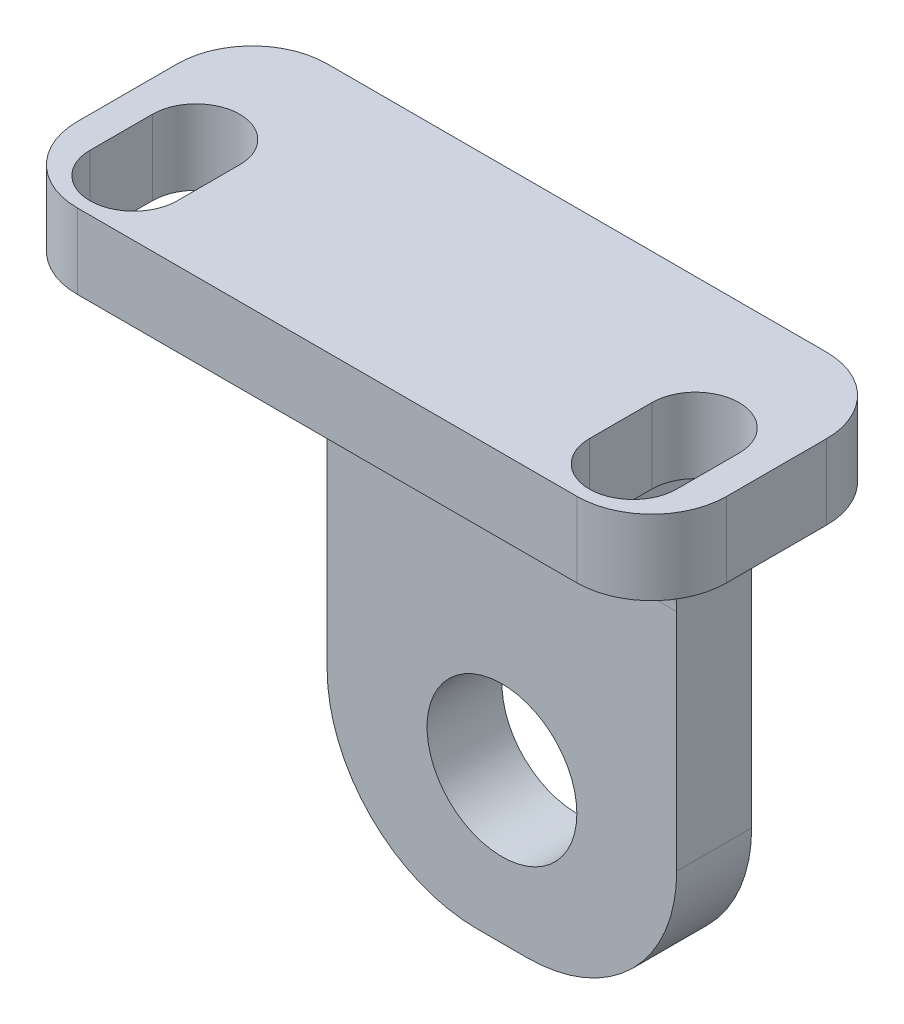
ISO-10303-21;
HEADER;
FILE_DESCRIPTION(('STEP AP214'),'2;1');
FILE_NAME('part.step','',(''),(''),'','','');
FILE_SCHEMA(('AUTOMOTIVE_DESIGN { 1 0 10303 214 1 1 1 1 }'));
ENDSEC;
DATA;
#1=APPLICATION_CONTEXT('core data for automotive mechanical design processes');
#2=APPLICATION_PROTOCOL_DEFINITION('international standard','automotive_design',2000,#1);
#3=PRODUCT_CONTEXT('',#1,'mechanical');
#4=PRODUCT('Part','Part','',(#3));
#5=PRODUCT_RELATED_PRODUCT_CATEGORY('part','',(#4));
#6=PRODUCT_DEFINITION_FORMATION('','',#4);
#7=PRODUCT_DEFINITION_CONTEXT('part definition',#1,'design');
#8=PRODUCT_DEFINITION('design','',#6,#7);
#9=PRODUCT_DEFINITION_SHAPE('','',#8);
#10=(LENGTH_UNIT() NAMED_UNIT(*) SI_UNIT(.MILLI.,.METRE.));
#11=(NAMED_UNIT(*) PLANE_ANGLE_UNIT() SI_UNIT($,.RADIAN.));
#12=(NAMED_UNIT(*) SI_UNIT($,.STERADIAN.) SOLID_ANGLE_UNIT());
#13=UNCERTAINTY_MEASURE_WITH_UNIT(LENGTH_MEASURE(1.E-05),#10,'distance_accuracy_value','');
#14=(GEOMETRIC_REPRESENTATION_CONTEXT(3) GLOBAL_UNCERTAINTY_ASSIGNED_CONTEXT((#13)) GLOBAL_UNIT_ASSIGNED_CONTEXT((#10,
#11,#12)) REPRESENTATION_CONTEXT('',''));
#15=CARTESIAN_POINT('',(0.,0.,0.));
#16=DIRECTION('',(0.,0.,1.));
#17=DIRECTION('',(1.,0.,0.));
#18=AXIS2_PLACEMENT_3D('',#15,#16,#17);
#19=CARTESIAN_POINT('',(0.,24.,0.));
#20=DIRECTION('',(0.,1.,0.));
#21=DIRECTION('',(0.,0.,1.));
#22=AXIS2_PLACEMENT_3D('',#19,#20,#21);
#23=PLANE('',#22);
#24=CARTESIAN_POINT('',(-10.,24.,7.75000000000001));
#25=DIRECTION('',(0.,1.,0.));
#26=DIRECTION('',(0.,0.,1.));
#27=AXIS2_PLACEMENT_3D('',#24,#25,#26);
#28=CIRCLE('',#27,1.75);
#29=CARTESIAN_POINT('',(-11.75,24.,7.75000000000001));
#30=VERTEX_POINT('',#29);
#31=CARTESIAN_POINT('',(-8.25,24.,7.75));
#32=VERTEX_POINT('',#31);
#33=EDGE_CURVE('E254',#30,#32,#28,.T.);
#34=ORIENTED_EDGE('',*,*,#33,.F.);
#35=DIRECTION('',(0.,0.,-1.));
#36=VECTOR('',#35,1.);
#37=CARTESIAN_POINT('',(-11.75,24.,7.75000000000001));
#38=LINE('',#37,#36);
#39=CARTESIAN_POINT('',(-11.75,24.,5.25000000000001));
#40=VERTEX_POINT('',#39);
#41=EDGE_CURVE('E240',#30,#40,#38,.T.);
#42=ORIENTED_EDGE('',*,*,#41,.T.);
#43=CARTESIAN_POINT('',(-10.,24.,5.25000000000001));
#44=DIRECTION('',(0.,1.,0.));
#45=DIRECTION('',(0.,0.,1.));
#46=AXIS2_PLACEMENT_3D('',#43,#44,#45);
#47=CIRCLE('',#46,1.75);
#48=CARTESIAN_POINT('',(-8.25,24.,5.25000000000002));
#49=VERTEX_POINT('',#48);
#50=EDGE_CURVE('E248',#49,#40,#47,.T.);
#51=ORIENTED_EDGE('',*,*,#50,.F.);
#52=DIRECTION('',(0.,0.,-1.));
#53=VECTOR('',#52,1.);
#54=CARTESIAN_POINT('',(-8.25,24.,7.75));
#55=LINE('',#54,#53);
#56=EDGE_CURVE('E251',#32,#49,#55,.T.);
#57=ORIENTED_EDGE('',*,*,#56,.F.);
#58=EDGE_LOOP('',(#34,#42,#51,#57));
#59=FACE_BOUND('',#58,.T.);
#60=DIRECTION('',(0.,0.,-1.));
#61=VECTOR('',#60,1.);
#62=CARTESIAN_POINT('',(13.,24.,10.));
#63=LINE('',#62,#61);
#64=CARTESIAN_POINT('',(13.,24.,7.));
#65=VERTEX_POINT('',#64);
#66=CARTESIAN_POINT('',(13.,24.,3.));
#67=VERTEX_POINT('',#66);
#68=EDGE_CURVE('E281',#65,#67,#63,.T.);
#69=ORIENTED_EDGE('',*,*,#68,.T.);
#70=CARTESIAN_POINT('',(10.,24.,3.));
#71=DIRECTION('',(0.,1.,0.));
#72=DIRECTION('',(0.,0.,1.));
#73=AXIS2_PLACEMENT_3D('',#70,#71,#72);
#74=CIRCLE('',#73,3.);
#75=CARTESIAN_POINT('',(10.,24.,0.));
#76=VERTEX_POINT('',#75);
#77=EDGE_CURVE('E326',#67,#76,#74,.T.);
#78=ORIENTED_EDGE('',*,*,#77,.T.);
#79=DIRECTION('',(-1.,0.,0.));
#80=VECTOR('',#79,1.);
#81=CARTESIAN_POINT('',(-7.,24.,0.));
#82=LINE('',#81,#80);
#83=CARTESIAN_POINT('',(-10.,24.,0.));
#84=VERTEX_POINT('',#83);
#85=EDGE_CURVE('E296',#76,#84,#82,.T.);
#86=ORIENTED_EDGE('',*,*,#85,.T.);
#87=CARTESIAN_POINT('',(-10.,24.,3.));
#88=DIRECTION('',(0.,1.,0.));
#89=DIRECTION('',(0.,0.,1.));
#90=AXIS2_PLACEMENT_3D('',#87,#88,#89);
#91=CIRCLE('',#90,3.);
#92=CARTESIAN_POINT('',(-13.,24.,3.));
#93=VERTEX_POINT('',#92);
#94=EDGE_CURVE('E324',#84,#93,#91,.T.);
#95=ORIENTED_EDGE('',*,*,#94,.T.);
#96=DIRECTION('',(0.,0.,-1.));
#97=VECTOR('',#96,1.);
#98=CARTESIAN_POINT('',(-13.,24.,10.));
#99=LINE('',#98,#97);
#100=CARTESIAN_POINT('',(-13.,24.,7.));
#101=VERTEX_POINT('',#100);
#102=EDGE_CURVE('E278',#101,#93,#99,.T.);
#103=ORIENTED_EDGE('',*,*,#102,.F.);
#104=CARTESIAN_POINT('',(-10.,24.,7.));
#105=DIRECTION('',(0.,1.,0.));
#106=DIRECTION('',(0.,0.,1.));
#107=AXIS2_PLACEMENT_3D('',#104,#105,#106);
#108=CIRCLE('',#107,3.);
#109=CARTESIAN_POINT('',(-10.,24.,10.));
#110=VERTEX_POINT('',#109);
#111=EDGE_CURVE('E320',#101,#110,#108,.T.);
#112=ORIENTED_EDGE('',*,*,#111,.T.);
#113=DIRECTION('',(-1.,0.,0.));
#114=VECTOR('',#113,1.);
#115=CARTESIAN_POINT('',(13.,24.,10.));
#116=LINE('',#115,#114);
#117=CARTESIAN_POINT('',(10.,24.,10.));
#118=VERTEX_POINT('',#117);
#119=EDGE_CURVE('E264',#118,#110,#116,.T.);
#120=ORIENTED_EDGE('',*,*,#119,.F.);
#121=CARTESIAN_POINT('',(10.,24.,7.));
#122=DIRECTION('',(0.,1.,0.));
#123=DIRECTION('',(0.,0.,1.));
#124=AXIS2_PLACEMENT_3D('',#121,#122,#123);
#125=CIRCLE('',#124,3.);
#126=EDGE_CURVE('E322',#118,#65,#125,.T.);
#127=ORIENTED_EDGE('',*,*,#126,.T.);
#128=EDGE_LOOP('',(#69,#78,#86,#95,#103,#112,#120,#127));
#129=FACE_BOUND('',#128,.T.);
#130=DIRECTION('',(0.,0.,-1.));
#131=VECTOR('',#130,1.);
#132=CARTESIAN_POINT('',(8.25,24.,0.));
#133=LINE('',#132,#131);
#134=CARTESIAN_POINT('',(8.25,24.,7.75));
#135=VERTEX_POINT('',#134);
#136=CARTESIAN_POINT('',(8.25,24.,5.25000000000002));
#137=VERTEX_POINT('',#136);
#138=EDGE_CURVE('E217',#135,#137,#133,.T.);
#139=ORIENTED_EDGE('',*,*,#138,.T.);
#140=CARTESIAN_POINT('',(10.,24.,5.25000000000001));
#141=DIRECTION('',(0.,1.,0.));
#142=DIRECTION('',(0.,0.,1.));
#143=AXIS2_PLACEMENT_3D('',#140,#141,#142);
#144=CIRCLE('',#143,1.75);
#145=CARTESIAN_POINT('',(11.75,24.,5.25000000000001));
#146=VERTEX_POINT('',#145);
#147=EDGE_CURVE('E210',#137,#146,#144,.F.);
#148=ORIENTED_EDGE('',*,*,#147,.T.);
#149=DIRECTION('',(0.,0.,-1.));
#150=VECTOR('',#149,1.);
#151=CARTESIAN_POINT('',(11.75,24.,0.));
#152=LINE('',#151,#150);
#153=CARTESIAN_POINT('',(11.75,24.,7.75));
#154=VERTEX_POINT('',#153);
#155=EDGE_CURVE('E211',#154,#146,#152,.T.);
#156=ORIENTED_EDGE('',*,*,#155,.F.);
#157=CARTESIAN_POINT('',(10.,24.,7.75000000000001));
#158=DIRECTION('',(0.,1.,0.));
#159=DIRECTION('',(0.,0.,1.));
#160=AXIS2_PLACEMENT_3D('',#157,#158,#159);
#161=CIRCLE('',#160,1.75);
#162=EDGE_CURVE('E224',#154,#135,#161,.F.);
#163=ORIENTED_EDGE('',*,*,#162,.T.);
#164=EDGE_LOOP('',(#139,#148,#156,#163));
#165=FACE_BOUND('',#164,.T.);
#166=ADVANCED_FACE('F33',(#59,#129,#165),#23,.T.);
#167=CARTESIAN_POINT('',(13.,21.,10.));
#168=DIRECTION('',(0.,1.,0.));
#169=DIRECTION('',(-1.,0.,0.));
#170=AXIS2_PLACEMENT_3D('',#167,#168,#169);
#171=PLANE('',#170);
#172=DIRECTION('',(1.,0.,0.));
#173=VECTOR('',#172,1.);
#174=CARTESIAN_POINT('',(7.,21.,9.));
#175=LINE('',#174,#173);
#176=CARTESIAN_POINT('',(-7.,21.,9.));
#177=VERTEX_POINT('',#176);
#178=CARTESIAN_POINT('',(7.00000000000001,21.,9.));
#179=VERTEX_POINT('',#178);
#180=EDGE_CURVE('E351',#177,#179,#175,.T.);
#181=ORIENTED_EDGE('',*,*,#180,.T.);
#182=DIRECTION('',(0.,0.,-1.));
#183=VECTOR('',#182,1.);
#184=CARTESIAN_POINT('',(7.,21.,0.));
#185=LINE('',#184,#183);
#186=CARTESIAN_POINT('',(7.,21.,0.));
#187=VERTEX_POINT('',#186);
#188=EDGE_CURVE('E286',#179,#187,#185,.T.);
#189=ORIENTED_EDGE('',*,*,#188,.T.);
#190=DIRECTION('',(1.,0.,0.));
#191=VECTOR('',#190,1.);
#192=CARTESIAN_POINT('',(13.,21.,0.));
#193=LINE('',#192,#191);
#194=CARTESIAN_POINT('',(10.,21.,0.));
#195=VERTEX_POINT('',#194);
#196=EDGE_CURVE('E202',#187,#195,#193,.T.);
#197=ORIENTED_EDGE('',*,*,#196,.T.);
#198=CARTESIAN_POINT('',(10.,21.,3.));
#199=DIRECTION('',(0.,1.,0.));
#200=DIRECTION('',(-1.,0.,0.));
#201=AXIS2_PLACEMENT_3D('',#198,#199,#200);
#202=CIRCLE('',#201,3.);
#203=CARTESIAN_POINT('',(13.,21.,3.));
#204=VERTEX_POINT('',#203);
#205=EDGE_CURVE('E338',#195,#204,#202,.F.);
#206=ORIENTED_EDGE('',*,*,#205,.T.);
#207=DIRECTION('',(0.,0.,-1.));
#208=VECTOR('',#207,1.);
#209=CARTESIAN_POINT('',(13.,21.,10.));
#210=LINE('',#209,#208);
#211=CARTESIAN_POINT('',(13.,21.,7.));
#212=VERTEX_POINT('',#211);
#213=EDGE_CURVE('E271',#212,#204,#210,.T.);
#214=ORIENTED_EDGE('',*,*,#213,.F.);
#215=CARTESIAN_POINT('',(10.,21.,7.));
#216=DIRECTION('',(0.,1.,0.));
#217=DIRECTION('',(-1.,0.,0.));
#218=AXIS2_PLACEMENT_3D('',#215,#216,#217);
#219=CIRCLE('',#218,3.);
#220=CARTESIAN_POINT('',(10.,21.,10.));
#221=VERTEX_POINT('',#220);
#222=EDGE_CURVE('E334',#212,#221,#219,.F.);
#223=ORIENTED_EDGE('',*,*,#222,.T.);
#224=DIRECTION('',(1.,0.,0.));
#225=VECTOR('',#224,1.);
#226=CARTESIAN_POINT('',(13.,21.,10.));
#227=LINE('',#226,#225);
#228=CARTESIAN_POINT('',(-10.,21.,10.));
#229=VERTEX_POINT('',#228);
#230=EDGE_CURVE('E267',#229,#221,#227,.T.);
#231=ORIENTED_EDGE('',*,*,#230,.F.);
#232=CARTESIAN_POINT('',(-10.,21.,7.));
#233=DIRECTION('',(0.,1.,0.));
#234=DIRECTION('',(-1.,0.,0.));
#235=AXIS2_PLACEMENT_3D('',#232,#233,#234);
#236=CIRCLE('',#235,3.);
#237=CARTESIAN_POINT('',(-13.,21.,7.));
#238=VERTEX_POINT('',#237);
#239=EDGE_CURVE('E332',#229,#238,#236,.F.);
#240=ORIENTED_EDGE('',*,*,#239,.T.);
#241=DIRECTION('',(0.,0.,-1.));
#242=VECTOR('',#241,1.);
#243=CARTESIAN_POINT('',(-13.,21.,10.));
#244=LINE('',#243,#242);
#245=CARTESIAN_POINT('',(-13.,21.,3.));
#246=VERTEX_POINT('',#245);
#247=EDGE_CURVE('E275',#238,#246,#244,.T.);
#248=ORIENTED_EDGE('',*,*,#247,.T.);
#249=CARTESIAN_POINT('',(-10.,21.,3.));
#250=DIRECTION('',(0.,1.,0.));
#251=DIRECTION('',(-1.,0.,0.));
#252=AXIS2_PLACEMENT_3D('',#249,#250,#251);
#253=CIRCLE('',#252,3.);
#254=CARTESIAN_POINT('',(-10.,21.,0.));
#255=VERTEX_POINT('',#254);
#256=EDGE_CURVE('E336',#246,#255,#253,.F.);
#257=ORIENTED_EDGE('',*,*,#256,.T.);
#258=CARTESIAN_POINT('',(-7.,21.,0.));
#259=VERTEX_POINT('',#258);
#260=EDGE_CURVE('E268',#255,#259,#193,.T.);
#261=ORIENTED_EDGE('',*,*,#260,.T.);
#262=DIRECTION('',(0.,0.,1.));
#263=VECTOR('',#262,1.);
#264=CARTESIAN_POINT('',(-7.,21.,0.));
#265=LINE('',#264,#263);
#266=EDGE_CURVE('E284',#259,#177,#265,.T.);
#267=ORIENTED_EDGE('',*,*,#266,.T.);
#268=EDGE_LOOP('',(#181,#189,#197,#206,#214,#223,#231,#240,#248,#257,#261,#267));
#269=FACE_BOUND('',#268,.T.);
#270=DIRECTION('',(0.,0.,1.));
#271=VECTOR('',#270,1.);
#272=CARTESIAN_POINT('',(-11.75,21.,7.75000000000001));
#273=LINE('',#272,#271);
#274=CARTESIAN_POINT('',(-11.75,21.,5.25000000000001));
#275=VERTEX_POINT('',#274);
#276=CARTESIAN_POINT('',(-11.75,21.,7.75000000000001));
#277=VERTEX_POINT('',#276);
#278=EDGE_CURVE('E259',#275,#277,#273,.T.);
#279=ORIENTED_EDGE('',*,*,#278,.T.);
#280=CARTESIAN_POINT('',(-10.,21.,7.75000000000001));
#281=DIRECTION('',(0.,1.,0.));
#282=DIRECTION('',(-1.,0.,0.));
#283=AXIS2_PLACEMENT_3D('',#280,#281,#282);
#284=CIRCLE('',#283,1.75);
#285=CARTESIAN_POINT('',(-8.25,21.,7.75));
#286=VERTEX_POINT('',#285);
#287=EDGE_CURVE('E256',#286,#277,#284,.F.);
#288=ORIENTED_EDGE('',*,*,#287,.F.);
#289=DIRECTION('',(0.,0.,1.));
#290=VECTOR('',#289,1.);
#291=CARTESIAN_POINT('',(-8.25,21.,7.75));
#292=LINE('',#291,#290);
#293=CARTESIAN_POINT('',(-8.25,21.,5.25000000000002));
#294=VERTEX_POINT('',#293);
#295=EDGE_CURVE('E233',#294,#286,#292,.T.);
#296=ORIENTED_EDGE('',*,*,#295,.F.);
#297=CARTESIAN_POINT('',(-10.,21.,5.25000000000001));
#298=DIRECTION('',(0.,1.,0.));
#299=DIRECTION('',(-1.,0.,0.));
#300=AXIS2_PLACEMENT_3D('',#297,#298,#299);
#301=CIRCLE('',#300,1.75);
#302=EDGE_CURVE('E262',#275,#294,#301,.F.);
#303=ORIENTED_EDGE('',*,*,#302,.F.);
#304=EDGE_LOOP('',(#279,#288,#296,#303));
#305=FACE_BOUND('',#304,.T.);
#306=CARTESIAN_POINT('',(10.,21.,5.25000000000001));
#307=DIRECTION('',(0.,1.,0.));
#308=DIRECTION('',(-1.,0.,0.));
#309=AXIS2_PLACEMENT_3D('',#306,#307,#308);
#310=CIRCLE('',#309,1.75);
#311=CARTESIAN_POINT('',(11.75,21.,5.25000000000001));
#312=VERTEX_POINT('',#311);
#313=CARTESIAN_POINT('',(8.25,21.,5.25000000000002));
#314=VERTEX_POINT('',#313);
#315=EDGE_CURVE('E207',#312,#314,#310,.T.);
#316=ORIENTED_EDGE('',*,*,#315,.T.);
#317=DIRECTION('',(0.,0.,1.));
#318=VECTOR('',#317,1.);
#319=CARTESIAN_POINT('',(8.25,21.,0.));
#320=LINE('',#319,#318);
#321=CARTESIAN_POINT('',(8.25,21.,7.75));
#322=VERTEX_POINT('',#321);
#323=EDGE_CURVE('E191',#314,#322,#320,.T.);
#324=ORIENTED_EDGE('',*,*,#323,.T.);
#325=CARTESIAN_POINT('',(10.,21.,7.75000000000001));
#326=DIRECTION('',(0.,1.,0.));
#327=DIRECTION('',(-1.,0.,0.));
#328=AXIS2_PLACEMENT_3D('',#325,#326,#327);
#329=CIRCLE('',#328,1.75);
#330=CARTESIAN_POINT('',(11.75,21.,7.75));
#331=VERTEX_POINT('',#330);
#332=EDGE_CURVE('E219',#322,#331,#329,.T.);
#333=ORIENTED_EDGE('',*,*,#332,.T.);
#334=DIRECTION('',(0.,0.,1.));
#335=VECTOR('',#334,1.);
#336=CARTESIAN_POINT('',(11.75,21.,0.));
#337=LINE('',#336,#335);
#338=EDGE_CURVE('E215',#312,#331,#337,.T.);
#339=ORIENTED_EDGE('',*,*,#338,.F.);
#340=EDGE_LOOP('',(#316,#324,#333,#339));
#341=FACE_BOUND('',#340,.T.);
#342=ADVANCED_FACE('F214',(#269,#305,#341),#171,.F.);
#343=CARTESIAN_POINT('',(7.,24.,0.));
#344=DIRECTION('',(-1.,0.,0.));
#345=DIRECTION('',(0.,0.,1.));
#346=AXIS2_PLACEMENT_3D('',#343,#344,#345);
#347=PLANE('',#346);
#348=DIRECTION('',(0.,-1.,0.));
#349=VECTOR('',#348,1.);
#350=CARTESIAN_POINT('',(7.,24.,3.));
#351=LINE('',#350,#349);
#352=CARTESIAN_POINT('',(7.,15.,3.));
#353=VERTEX_POINT('',#352);
#354=CARTESIAN_POINT('',(7.,6.,3.));
#355=VERTEX_POINT('',#354);
#356=EDGE_CURVE('E299',#353,#355,#351,.T.);
#357=ORIENTED_EDGE('',*,*,#356,.T.);
#358=DIRECTION('',(0.,0.,-1.));
#359=VECTOR('',#358,1.);
#360=CARTESIAN_POINT('',(7.,6.,0.));
#361=LINE('',#360,#359);
#362=CARTESIAN_POINT('',(7.,6.,0.));
#363=VERTEX_POINT('',#362);
#364=EDGE_CURVE('E369',#355,#363,#361,.T.);
#365=ORIENTED_EDGE('',*,*,#364,.T.);
#366=DIRECTION('',(0.,-1.,0.));
#367=VECTOR('',#366,1.);
#368=CARTESIAN_POINT('',(7.,24.,0.));
#369=LINE('',#368,#367);
#370=EDGE_CURVE('E312',#187,#363,#369,.T.);
#371=ORIENTED_EDGE('',*,*,#370,.F.);
#372=ORIENTED_EDGE('',*,*,#188,.F.);
#373=CARTESIAN_POINT('',(7.00000000000001,15.,9.));
#374=DIRECTION('',(-1.,0.,0.));
#375=DIRECTION('',(0.,0.,1.));
#376=AXIS2_PLACEMENT_3D('',#373,#374,#375);
#377=CIRCLE('',#376,6.);
#378=EDGE_CURVE('E41',#179,#353,#377,.T.);
#379=ORIENTED_EDGE('',*,*,#378,.T.);
#380=EDGE_LOOP('',(#357,#365,#371,#372,#379));
#381=FACE_BOUND('',#380,.T.);
#382=ADVANCED_FACE('F373',(#381),#347,.F.);
#383=CARTESIAN_POINT('',(-7.,24.,0.));
#384=DIRECTION('',(1.,0.,0.));
#385=DIRECTION('',(0.,0.,-1.));
#386=AXIS2_PLACEMENT_3D('',#383,#384,#385);
#387=PLANE('',#386);
#388=DIRECTION('',(0.,-1.,0.));
#389=VECTOR('',#388,1.);
#390=CARTESIAN_POINT('',(-7.,24.,0.));
#391=LINE('',#390,#389);
#392=CARTESIAN_POINT('',(-7.,6.,0.));
#393=VERTEX_POINT('',#392);
#394=EDGE_CURVE('E309',#259,#393,#391,.T.);
#395=ORIENTED_EDGE('',*,*,#394,.T.);
#396=DIRECTION('',(0.,0.,1.));
#397=VECTOR('',#396,1.);
#398=CARTESIAN_POINT('',(-7.,6.,0.));
#399=LINE('',#398,#397);
#400=CARTESIAN_POINT('',(-7.,6.,3.));
#401=VERTEX_POINT('',#400);
#402=EDGE_CURVE('E360',#393,#401,#399,.T.);
#403=ORIENTED_EDGE('',*,*,#402,.T.);
#404=DIRECTION('',(0.,-1.,0.));
#405=VECTOR('',#404,1.);
#406=CARTESIAN_POINT('',(-7.,24.,3.));
#407=LINE('',#406,#405);
#408=CARTESIAN_POINT('',(-7.,15.,3.));
#409=VERTEX_POINT('',#408);
#410=EDGE_CURVE('E306',#409,#401,#407,.T.);
#411=ORIENTED_EDGE('',*,*,#410,.F.);
#412=CARTESIAN_POINT('',(-6.99999999999999,15.,9.));
#413=DIRECTION('',(1.,0.,0.));
#414=DIRECTION('',(0.,0.,-1.));
#415=AXIS2_PLACEMENT_3D('',#412,#413,#414);
#416=CIRCLE('',#415,6.);
#417=EDGE_CURVE('E11',#409,#177,#416,.T.);
#418=ORIENTED_EDGE('',*,*,#417,.T.);
#419=ORIENTED_EDGE('',*,*,#266,.F.);
#420=EDGE_LOOP('',(#395,#403,#411,#418,#419));
#421=FACE_BOUND('',#420,.T.);
#422=ADVANCED_FACE('F385',(#421),#387,.F.);
#423=CARTESIAN_POINT('',(-7.,24.,3.));
#424=DIRECTION('',(0.,0.,-1.));
#425=DIRECTION('',(-1.,0.,0.));
#426=AXIS2_PLACEMENT_3D('',#423,#424,#425);
#427=PLANE('',#426);
#428=CARTESIAN_POINT('',(0.,6.,3.));
#429=DIRECTION('',(0.,0.,1.));
#430=DIRECTION('',(1.,0.,0.));
#431=AXIS2_PLACEMENT_3D('',#428,#429,#430);
#432=CIRCLE('',#431,3.);
#433=CARTESIAN_POINT('',(3.,6.,3.));
#434=VERTEX_POINT('',#433);
#435=EDGE_CURVE('E289',#434,#434,#432,.T.);
#436=ORIENTED_EDGE('',*,*,#435,.F.);
#437=EDGE_LOOP('',(#436));
#438=FACE_BOUND('',#437,.T.);
#439=ORIENTED_EDGE('',*,*,#356,.F.);
#440=DIRECTION('',(1.,0.,0.));
#441=VECTOR('',#440,1.);
#442=CARTESIAN_POINT('',(-7.,15.,3.));
#443=LINE('',#442,#441);
#444=EDGE_CURVE('E358',#353,#409,#443,.F.);
#445=ORIENTED_EDGE('',*,*,#444,.T.);
#446=ORIENTED_EDGE('',*,*,#410,.T.);
#447=CARTESIAN_POINT('',(-1.,6.,3.));
#448=DIRECTION('',(0.,0.,-1.));
#449=DIRECTION('',(-1.,0.,0.));
#450=AXIS2_PLACEMENT_3D('',#447,#448,#449);
#451=CIRCLE('',#450,6.);
#452=CARTESIAN_POINT('',(-1.,0.,3.));
#453=VERTEX_POINT('',#452);
#454=EDGE_CURVE('E356',#401,#453,#451,.F.);
#455=ORIENTED_EDGE('',*,*,#454,.T.);
#456=DIRECTION('',(1.,0.,0.));
#457=VECTOR('',#456,1.);
#458=CARTESIAN_POINT('',(-7.,0.,3.));
#459=LINE('',#458,#457);
#460=CARTESIAN_POINT('',(1.,0.,3.));
#461=VERTEX_POINT('',#460);
#462=EDGE_CURVE('E300',#453,#461,#459,.T.);
#463=ORIENTED_EDGE('',*,*,#462,.T.);
#464=CARTESIAN_POINT('',(1.,6.,3.));
#465=DIRECTION('',(0.,0.,-1.));
#466=DIRECTION('',(-1.,0.,0.));
#467=AXIS2_PLACEMENT_3D('',#464,#465,#466);
#468=CIRCLE('',#467,6.);
#469=EDGE_CURVE('E354',#461,#355,#468,.F.);
#470=ORIENTED_EDGE('',*,*,#469,.T.);
#471=EDGE_LOOP('',(#439,#445,#446,#455,#463,#470));
#472=FACE_BOUND('',#471,.T.);
#473=ADVANCED_FACE('F378',(#438,#472),#427,.F.);
#474=CARTESIAN_POINT('',(-7.,24.,0.));
#475=DIRECTION('',(0.,0.,1.));
#476=DIRECTION('',(1.,0.,0.));
#477=AXIS2_PLACEMENT_3D('',#474,#475,#476);
#478=PLANE('',#477);
#479=DIRECTION('',(-1.,0.,0.));
#480=VECTOR('',#479,1.);
#481=CARTESIAN_POINT('',(-7.,0.,0.));
#482=LINE('',#481,#480);
#483=CARTESIAN_POINT('',(0.999999999999997,0.,0.));
#484=VERTEX_POINT('',#483);
#485=CARTESIAN_POINT('',(-1.,0.,0.));
#486=VERTEX_POINT('',#485);
#487=EDGE_CURVE('E295',#484,#486,#482,.T.);
#488=ORIENTED_EDGE('',*,*,#487,.T.);
#489=CARTESIAN_POINT('',(-1.,6.,0.));
#490=DIRECTION('',(0.,0.,1.));
#491=DIRECTION('',(1.,0.,0.));
#492=AXIS2_PLACEMENT_3D('',#489,#490,#491);
#493=CIRCLE('',#492,6.);
#494=EDGE_CURVE('E367',#486,#393,#493,.F.);
#495=ORIENTED_EDGE('',*,*,#494,.T.);
#496=ORIENTED_EDGE('',*,*,#394,.F.);
#497=ORIENTED_EDGE('',*,*,#260,.F.);
#498=DIRECTION('',(0.,-1.,0.));
#499=VECTOR('',#498,1.);
#500=CARTESIAN_POINT('',(-10.,24.,0.));
#501=LINE('',#500,#499);
#502=EDGE_CURVE('E328',#255,#84,#501,.F.);
#503=ORIENTED_EDGE('',*,*,#502,.T.);
#504=ORIENTED_EDGE('',*,*,#85,.F.);
#505=DIRECTION('',(0.,1.,0.));
#506=VECTOR('',#505,1.);
#507=CARTESIAN_POINT('',(10.,24.,0.));
#508=LINE('',#507,#506);
#509=EDGE_CURVE('E330',#76,#195,#508,.F.);
#510=ORIENTED_EDGE('',*,*,#509,.T.);
#511=ORIENTED_EDGE('',*,*,#196,.F.);
#512=ORIENTED_EDGE('',*,*,#370,.T.);
#513=CARTESIAN_POINT('',(0.999999999999997,6.,0.));
#514=DIRECTION('',(0.,0.,1.));
#515=DIRECTION('',(1.,0.,0.));
#516=AXIS2_PLACEMENT_3D('',#513,#514,#515);
#517=CIRCLE('',#516,6.);
#518=EDGE_CURVE('E48',#363,#484,#517,.F.);
#519=ORIENTED_EDGE('',*,*,#518,.T.);
#520=EDGE_LOOP('',(#488,#495,#496,#497,#503,#504,#510,#511,#512,#519));
#521=FACE_BOUND('',#520,.T.);
#522=CARTESIAN_POINT('',(0.,6.,0.));
#523=DIRECTION('',(0.,0.,1.));
#524=DIRECTION('',(1.,0.,0.));
#525=AXIS2_PLACEMENT_3D('',#522,#523,#524);
#526=CIRCLE('',#525,3.);
#527=CARTESIAN_POINT('',(3.,6.,0.));
#528=VERTEX_POINT('',#527);
#529=EDGE_CURVE('E292',#528,#528,#526,.F.);
#530=ORIENTED_EDGE('',*,*,#529,.F.);
#531=EDGE_LOOP('',(#530));
#532=FACE_BOUND('',#531,.T.);
#533=ADVANCED_FACE('F393',(#521,#532),#478,.F.);
#534=CARTESIAN_POINT('',(0.,0.,0.));
#535=DIRECTION('',(0.,1.,0.));
#536=DIRECTION('',(0.,0.,1.));
#537=AXIS2_PLACEMENT_3D('',#534,#535,#536);
#538=PLANE('',#537);
#539=ORIENTED_EDGE('',*,*,#462,.F.);
#540=DIRECTION('',(0.,0.,1.));
#541=VECTOR('',#540,1.);
#542=CARTESIAN_POINT('',(-1.,0.,0.));
#543=LINE('',#542,#541);
#544=EDGE_CURVE('E56',#453,#486,#543,.F.);
#545=ORIENTED_EDGE('',*,*,#544,.T.);
#546=ORIENTED_EDGE('',*,*,#487,.F.);
#547=DIRECTION('',(0.,0.,-1.));
#548=VECTOR('',#547,1.);
#549=CARTESIAN_POINT('',(0.999999999999997,0.,0.));
#550=LINE('',#549,#548);
#551=EDGE_CURVE('E363',#484,#461,#550,.F.);
#552=ORIENTED_EDGE('',*,*,#551,.T.);
#553=EDGE_LOOP('',(#539,#545,#546,#552));
#554=FACE_BOUND('',#553,.T.);
#555=ADVANCED_FACE('F389',(#554),#538,.F.);
#556=CARTESIAN_POINT('',(0.,6.,-0.00100000000000013));
#557=DIRECTION('',(0.,0.,1.));
#558=DIRECTION('',(1.,0.,0.));
#559=AXIS2_PLACEMENT_3D('',#556,#557,#558);
#560=CYLINDRICAL_SURFACE('',#559,3.);
#561=CARTESIAN_POINT('',(3.,6.,3.));
#562=CARTESIAN_POINT('',(3.,6.,2.96875));
#563=CARTESIAN_POINT('',(3.,6.,2.9375));
#564=CARTESIAN_POINT('',(3.,6.,2.875));
#565=CARTESIAN_POINT('',(3.,6.,2.84375));
#566=CARTESIAN_POINT('',(3.,6.,2.78125));
#567=CARTESIAN_POINT('',(3.,6.,2.75));
#568=CARTESIAN_POINT('',(3.,6.,2.6875));
#569=CARTESIAN_POINT('',(3.,6.,2.65625));
#570=CARTESIAN_POINT('',(3.,6.,2.59375));
#571=CARTESIAN_POINT('',(3.,6.,2.5625));
#572=CARTESIAN_POINT('',(3.,6.,2.5));
#573=CARTESIAN_POINT('',(3.,6.,2.46875));
#574=CARTESIAN_POINT('',(3.,6.,2.40625));
#575=CARTESIAN_POINT('',(3.,6.,2.375));
#576=CARTESIAN_POINT('',(3.,6.,2.3125));
#577=CARTESIAN_POINT('',(3.,6.,2.28125));
#578=CARTESIAN_POINT('',(3.,6.,2.21875));
#579=CARTESIAN_POINT('',(3.,6.,2.1875));
#580=CARTESIAN_POINT('',(3.,6.,2.125));
#581=CARTESIAN_POINT('',(3.,6.,2.09375));
#582=CARTESIAN_POINT('',(3.,6.,2.03125));
#583=CARTESIAN_POINT('',(3.,6.,2.));
#584=CARTESIAN_POINT('',(3.,6.,1.9375));
#585=CARTESIAN_POINT('',(3.,6.,1.90625));
#586=CARTESIAN_POINT('',(3.,6.,1.84375));
#587=CARTESIAN_POINT('',(3.,6.,1.8125));
#588=CARTESIAN_POINT('',(3.,6.,1.75));
#589=CARTESIAN_POINT('',(3.,6.,1.71875));
#590=CARTESIAN_POINT('',(3.,6.,1.65625));
#591=CARTESIAN_POINT('',(3.,6.,1.625));
#592=CARTESIAN_POINT('',(3.,6.,1.5625));
#593=CARTESIAN_POINT('',(3.,6.,1.53125));
#594=CARTESIAN_POINT('',(3.,6.,1.46875));
#595=CARTESIAN_POINT('',(3.,6.,1.4375));
#596=CARTESIAN_POINT('',(3.,6.,1.375));
#597=CARTESIAN_POINT('',(3.,6.,1.34375));
#598=CARTESIAN_POINT('',(3.,6.,1.28125));
#599=CARTESIAN_POINT('',(3.,6.,1.25));
#600=CARTESIAN_POINT('',(3.,6.,1.1875));
#601=CARTESIAN_POINT('',(3.,6.,1.15625));
#602=CARTESIAN_POINT('',(3.,6.,1.09375));
#603=CARTESIAN_POINT('',(3.,6.,1.0625));
#604=CARTESIAN_POINT('',(3.,6.,1.));
#605=CARTESIAN_POINT('',(3.,6.,0.96875));
#606=CARTESIAN_POINT('',(3.,6.,0.90625));
#607=CARTESIAN_POINT('',(3.,6.,0.875));
#608=CARTESIAN_POINT('',(3.,6.,0.8125));
#609=CARTESIAN_POINT('',(3.,6.,0.78125));
#610=CARTESIAN_POINT('',(3.,6.,0.71875));
#611=CARTESIAN_POINT('',(3.,6.,0.6875));
#612=CARTESIAN_POINT('',(3.,6.,0.625));
#613=CARTESIAN_POINT('',(3.,6.,0.59375));
#614=CARTESIAN_POINT('',(3.,6.,0.53125));
#615=CARTESIAN_POINT('',(3.,6.,0.5));
#616=CARTESIAN_POINT('',(3.,6.,0.4375));
#617=CARTESIAN_POINT('',(3.,6.,0.40625));
#618=CARTESIAN_POINT('',(3.,6.,0.34375));
#619=CARTESIAN_POINT('',(3.,6.,0.3125));
#620=CARTESIAN_POINT('',(3.,6.,0.25));
#621=CARTESIAN_POINT('',(3.,6.,0.21875));
#622=CARTESIAN_POINT('',(3.,6.,0.15625));
#623=CARTESIAN_POINT('',(3.,6.,0.125));
#624=CARTESIAN_POINT('',(3.,6.,0.0625000000000001));
#625=CARTESIAN_POINT('',(3.,6.,0.0312500000000001));
#626=CARTESIAN_POINT('',(3.,6.,0.));
#627=B_SPLINE_CURVE_WITH_KNOTS('',3,(#561,#562,#563,#564,#565,#566,#567,#568,#569,#570,#571,
#572,#573,#574,#575,#576,#577,#578,#579,#580,#581,#582,#583,#584,#585,#586,#587,#588,#589,#590,
#591,#592,#593,#594,#595,#596,#597,#598,#599,#600,#601,#602,#603,#604,#605,#606,#607,#608,#609,
#610,#611,#612,#613,#614,#615,#616,#617,#618,#619,#620,#621,#622,#623,#624,#625,#626),
.UNSPECIFIED.,.F.,.F.,(4,2,2,2,2,2,2,2,2,2,2,2,2,2,2,2,2,2,2,2,2,2,2,2,2,2,2,2,2,2,2,2,4),(0.,
0.0937500000000001,0.1875,0.28125,0.375,0.46875,0.5625,0.65625,0.75,0.84375,0.9375,1.03125,
1.125,1.21875,1.3125,1.40625,1.5,1.59375,1.6875,1.78125,1.875,1.96875,2.0625,2.15625,2.25,
2.34375,2.4375,2.53125,2.625,2.71875,2.8125,2.90625,3.),.UNSPECIFIED.);
#628=EDGE_CURVE('BSEAM453',#434,#528,#627,.T.);
#629=ORIENTED_EDGE('',*,*,#435,.T.);
#630=ORIENTED_EDGE('',*,*,#529,.T.);
#631=ORIENTED_EDGE('',*,*,#628,.T.);
#632=ORIENTED_EDGE('',*,*,#628,.F.);
#633=EDGE_LOOP('',(#629,#631,#630,#632));
#634=FACE_BOUND('',#633,.T.);
#635=ADVANCED_FACE('F453',(#634),#560,.F.);
#636=CARTESIAN_POINT('',(13.,21.,10.));
#637=DIRECTION('',(-1.,0.,0.));
#638=DIRECTION('',(0.,0.,1.));
#639=AXIS2_PLACEMENT_3D('',#636,#637,#638);
#640=PLANE('',#639);
#641=ORIENTED_EDGE('',*,*,#213,.T.);
#642=DIRECTION('',(0.,1.,0.));
#643=VECTOR('',#642,1.);
#644=CARTESIAN_POINT('',(13.,21.,3.));
#645=LINE('',#644,#643);
#646=EDGE_CURVE('E317',#204,#67,#645,.T.);
#647=ORIENTED_EDGE('',*,*,#646,.T.);
#648=ORIENTED_EDGE('',*,*,#68,.F.);
#649=DIRECTION('',(0.,1.,0.));
#650=VECTOR('',#649,1.);
#651=CARTESIAN_POINT('',(13.,21.,7.));
#652=LINE('',#651,#650);
#653=EDGE_CURVE('E315',#65,#212,#652,.F.);
#654=ORIENTED_EDGE('',*,*,#653,.T.);
#655=EDGE_LOOP('',(#641,#647,#648,#654));
#656=FACE_BOUND('',#655,.T.);
#657=ADVANCED_FACE('F409',(#656),#640,.F.);
#658=CARTESIAN_POINT('',(-13.,21.,10.));
#659=DIRECTION('',(1.,0.,0.));
#660=DIRECTION('',(0.,0.,-1.));
#661=AXIS2_PLACEMENT_3D('',#658,#659,#660);
#662=PLANE('',#661);
#663=ORIENTED_EDGE('',*,*,#102,.T.);
#664=DIRECTION('',(0.,-1.,0.));
#665=VECTOR('',#664,1.);
#666=CARTESIAN_POINT('',(-13.,21.,3.));
#667=LINE('',#666,#665);
#668=EDGE_CURVE('E342',#93,#246,#667,.T.);
#669=ORIENTED_EDGE('',*,*,#668,.T.);
#670=ORIENTED_EDGE('',*,*,#247,.F.);
#671=DIRECTION('',(0.,-1.,0.));
#672=VECTOR('',#671,1.);
#673=CARTESIAN_POINT('',(-13.,24.,7.));
#674=LINE('',#673,#672);
#675=EDGE_CURVE('E340',#238,#101,#674,.F.);
#676=ORIENTED_EDGE('',*,*,#675,.T.);
#677=EDGE_LOOP('',(#663,#669,#670,#676));
#678=FACE_BOUND('',#677,.T.);
#679=ADVANCED_FACE('F426',(#678),#662,.F.);
#680=CARTESIAN_POINT('',(0.,0.,10.));
#681=DIRECTION('',(0.,0.,1.));
#682=DIRECTION('',(1.,0.,0.));
#683=AXIS2_PLACEMENT_3D('',#680,#681,#682);
#684=PLANE('',#683);
#685=ORIENTED_EDGE('',*,*,#230,.T.);
#686=DIRECTION('',(0.,1.,0.));
#687=VECTOR('',#686,1.);
#688=CARTESIAN_POINT('',(10.,24.,10.));
#689=LINE('',#688,#687);
#690=EDGE_CURVE('E348',#221,#118,#689,.T.);
#691=ORIENTED_EDGE('',*,*,#690,.T.);
#692=ORIENTED_EDGE('',*,*,#119,.T.);
#693=DIRECTION('',(0.,-1.,0.));
#694=VECTOR('',#693,1.);
#695=CARTESIAN_POINT('',(-10.,21.,10.));
#696=LINE('',#695,#694);
#697=EDGE_CURVE('E345',#110,#229,#696,.T.);
#698=ORIENTED_EDGE('',*,*,#697,.T.);
#699=EDGE_LOOP('',(#685,#691,#692,#698));
#700=FACE_BOUND('',#699,.T.);
#701=ADVANCED_FACE('F419',(#700),#684,.T.);
#702=CARTESIAN_POINT('',(-10.,-0.001000000000001,7.75000000000001));
#703=DIRECTION('',(0.,1.,0.));
#704=DIRECTION('',(0.,0.,1.));
#705=AXIS2_PLACEMENT_3D('',#702,#703,#704);
#706=CYLINDRICAL_SURFACE('',#705,1.75);
#707=ORIENTED_EDGE('',*,*,#287,.T.);
#708=DIRECTION('',(0.,1.,0.));
#709=VECTOR('',#708,1.);
#710=CARTESIAN_POINT('',(-11.75,-0.001000000000001,7.75000000000001));
#711=LINE('',#710,#709);
#712=EDGE_CURVE('E236',#277,#30,#711,.T.);
#713=ORIENTED_EDGE('',*,*,#712,.T.);
#714=ORIENTED_EDGE('',*,*,#33,.T.);
#715=DIRECTION('',(0.,1.,0.));
#716=VECTOR('',#715,1.);
#717=CARTESIAN_POINT('',(-8.25,-0.001000000000001,7.75));
#718=LINE('',#717,#716);
#719=EDGE_CURVE('E237',#286,#32,#718,.T.);
#720=ORIENTED_EDGE('',*,*,#719,.F.);
#721=EDGE_LOOP('',(#707,#713,#714,#720));
#722=FACE_BOUND('',#721,.T.);
#723=ADVANCED_FACE('F510',(#722),#706,.F.);
#724=CARTESIAN_POINT('',(-11.75,-0.001000000000001,7.75000000000001));
#725=DIRECTION('',(1.,0.,0.));
#726=DIRECTION('',(0.,0.,-1.));
#727=AXIS2_PLACEMENT_3D('',#724,#725,#726);
#728=PLANE('',#727);
#729=DIRECTION('',(0.,1.,0.));
#730=VECTOR('',#729,1.);
#731=CARTESIAN_POINT('',(-11.75,-0.001000000000001,5.25000000000001));
#732=LINE('',#731,#730);
#733=EDGE_CURVE('E243',#275,#40,#732,.T.);
#734=ORIENTED_EDGE('',*,*,#733,.T.);
#735=ORIENTED_EDGE('',*,*,#41,.F.);
#736=ORIENTED_EDGE('',*,*,#712,.F.);
#737=ORIENTED_EDGE('',*,*,#278,.F.);
#738=EDGE_LOOP('',(#734,#735,#736,#737));
#739=FACE_BOUND('',#738,.T.);
#740=ADVANCED_FACE('F517',(#739),#728,.T.);
#741=CARTESIAN_POINT('',(-10.,-0.001000000000001,5.25000000000001));
#742=DIRECTION('',(0.,1.,0.));
#743=DIRECTION('',(0.,0.,1.));
#744=AXIS2_PLACEMENT_3D('',#741,#742,#743);
#745=CYLINDRICAL_SURFACE('',#744,1.75);
#746=ORIENTED_EDGE('',*,*,#302,.T.);
#747=DIRECTION('',(0.,1.,0.));
#748=VECTOR('',#747,1.);
#749=CARTESIAN_POINT('',(-8.25,-0.001000000000001,5.25000000000002));
#750=LINE('',#749,#748);
#751=EDGE_CURVE('E241',#294,#49,#750,.T.);
#752=ORIENTED_EDGE('',*,*,#751,.T.);
#753=ORIENTED_EDGE('',*,*,#50,.T.);
#754=ORIENTED_EDGE('',*,*,#733,.F.);
#755=EDGE_LOOP('',(#746,#752,#753,#754));
#756=FACE_BOUND('',#755,.T.);
#757=ADVANCED_FACE('F525',(#756),#745,.F.);
#758=CARTESIAN_POINT('',(-8.25,-0.001000000000001,7.75));
#759=DIRECTION('',(1.,0.,0.));
#760=DIRECTION('',(0.,0.,-1.));
#761=AXIS2_PLACEMENT_3D('',#758,#759,#760);
#762=PLANE('',#761);
#763=ORIENTED_EDGE('',*,*,#295,.T.);
#764=ORIENTED_EDGE('',*,*,#719,.T.);
#765=ORIENTED_EDGE('',*,*,#56,.T.);
#766=ORIENTED_EDGE('',*,*,#751,.F.);
#767=EDGE_LOOP('',(#763,#764,#765,#766));
#768=FACE_BOUND('',#767,.T.);
#769=ADVANCED_FACE('F533',(#768),#762,.F.);
#770=CARTESIAN_POINT('',(10.,-0.001000000000001,5.25000000000001));
#771=DIRECTION('',(0.,1.,0.));
#772=DIRECTION('',(0.,0.,1.));
#773=AXIS2_PLACEMENT_3D('',#770,#771,#772);
#774=CYLINDRICAL_SURFACE('',#773,1.75);
#775=DIRECTION('',(0.,1.,0.));
#776=VECTOR('',#775,1.);
#777=CARTESIAN_POINT('',(11.75,-0.001000000000001,5.25000000000001));
#778=LINE('',#777,#776);
#779=EDGE_CURVE('E203',#312,#146,#778,.T.);
#780=ORIENTED_EDGE('',*,*,#779,.T.);
#781=ORIENTED_EDGE('',*,*,#147,.F.);
#782=DIRECTION('',(0.,1.,0.));
#783=VECTOR('',#782,1.);
#784=CARTESIAN_POINT('',(8.25,-0.001000000000001,5.25000000000002));
#785=LINE('',#784,#783);
#786=EDGE_CURVE('E195',#314,#137,#785,.T.);
#787=ORIENTED_EDGE('',*,*,#786,.F.);
#788=ORIENTED_EDGE('',*,*,#315,.F.);
#789=EDGE_LOOP('',(#780,#781,#787,#788));
#790=FACE_BOUND('',#789,.T.);
#791=ADVANCED_FACE('F206',(#790),#774,.F.);
#792=CARTESIAN_POINT('',(11.75,-0.001000000000001,0.));
#793=DIRECTION('',(1.,0.,0.));
#794=DIRECTION('',(0.,0.,-1.));
#795=AXIS2_PLACEMENT_3D('',#792,#793,#794);
#796=PLANE('',#795);
#797=ORIENTED_EDGE('',*,*,#338,.T.);
#798=DIRECTION('',(0.,1.,0.));
#799=VECTOR('',#798,1.);
#800=CARTESIAN_POINT('',(11.75,-0.001000000000001,7.75));
#801=LINE('',#800,#799);
#802=EDGE_CURVE('E230',#331,#154,#801,.T.);
#803=ORIENTED_EDGE('',*,*,#802,.T.);
#804=ORIENTED_EDGE('',*,*,#155,.T.);
#805=ORIENTED_EDGE('',*,*,#779,.F.);
#806=EDGE_LOOP('',(#797,#803,#804,#805));
#807=FACE_BOUND('',#806,.T.);
#808=ADVANCED_FACE('F548',(#807),#796,.F.);
#809=CARTESIAN_POINT('',(10.,-0.001000000000001,7.75000000000001));
#810=DIRECTION('',(0.,1.,0.));
#811=DIRECTION('',(0.,0.,1.));
#812=AXIS2_PLACEMENT_3D('',#809,#810,#811);
#813=CYLINDRICAL_SURFACE('',#812,1.75);
#814=DIRECTION('',(0.,1.,0.));
#815=VECTOR('',#814,1.);
#816=CARTESIAN_POINT('',(8.25,-0.001000000000001,7.75));
#817=LINE('',#816,#815);
#818=EDGE_CURVE('E197',#322,#135,#817,.T.);
#819=ORIENTED_EDGE('',*,*,#818,.T.);
#820=ORIENTED_EDGE('',*,*,#162,.F.);
#821=ORIENTED_EDGE('',*,*,#802,.F.);
#822=ORIENTED_EDGE('',*,*,#332,.F.);
#823=EDGE_LOOP('',(#819,#820,#821,#822));
#824=FACE_BOUND('',#823,.T.);
#825=ADVANCED_FACE('F555',(#824),#813,.F.);
#826=CARTESIAN_POINT('',(8.25,-0.001000000000001,0.));
#827=DIRECTION('',(1.,0.,0.));
#828=DIRECTION('',(0.,0.,-1.));
#829=AXIS2_PLACEMENT_3D('',#826,#827,#828);
#830=PLANE('',#829);
#831=ORIENTED_EDGE('',*,*,#786,.T.);
#832=ORIENTED_EDGE('',*,*,#138,.F.);
#833=ORIENTED_EDGE('',*,*,#818,.F.);
#834=ORIENTED_EDGE('',*,*,#323,.F.);
#835=EDGE_LOOP('',(#831,#832,#833,#834));
#836=FACE_BOUND('',#835,.T.);
#837=ADVANCED_FACE('F193',(#836),#830,.T.);
#838=CARTESIAN_POINT('',(10.,21.,3.));
#839=DIRECTION('',(0.,1.,0.));
#840=DIRECTION('',(0.,0.,1.));
#841=AXIS2_PLACEMENT_3D('',#838,#839,#840);
#842=CYLINDRICAL_SURFACE('',#841,3.);
#843=ORIENTED_EDGE('',*,*,#205,.F.);
#844=ORIENTED_EDGE('',*,*,#509,.F.);
#845=ORIENTED_EDGE('',*,*,#77,.F.);
#846=ORIENTED_EDGE('',*,*,#646,.F.);
#847=EDGE_LOOP('',(#843,#844,#845,#846));
#848=FACE_BOUND('',#847,.T.);
#849=ADVANCED_FACE('F406',(#848),#842,.T.);
#850=CARTESIAN_POINT('',(-10.,21.,3.));
#851=DIRECTION('',(0.,-1.,0.));
#852=DIRECTION('',(0.,0.,-1.));
#853=AXIS2_PLACEMENT_3D('',#850,#851,#852);
#854=CYLINDRICAL_SURFACE('',#853,3.);
#855=ORIENTED_EDGE('',*,*,#94,.F.);
#856=ORIENTED_EDGE('',*,*,#502,.F.);
#857=ORIENTED_EDGE('',*,*,#256,.F.);
#858=ORIENTED_EDGE('',*,*,#668,.F.);
#859=EDGE_LOOP('',(#855,#856,#857,#858));
#860=FACE_BOUND('',#859,.T.);
#861=ADVANCED_FACE('F433',(#860),#854,.T.);
#862=CARTESIAN_POINT('',(10.,0.,7.));
#863=DIRECTION('',(0.,-1.,0.));
#864=DIRECTION('',(0.,0.,-1.));
#865=AXIS2_PLACEMENT_3D('',#862,#863,#864);
#866=CYLINDRICAL_SURFACE('',#865,3.);
#867=ORIENTED_EDGE('',*,*,#222,.F.);
#868=ORIENTED_EDGE('',*,*,#653,.F.);
#869=ORIENTED_EDGE('',*,*,#126,.F.);
#870=ORIENTED_EDGE('',*,*,#690,.F.);
#871=EDGE_LOOP('',(#867,#868,#869,#870));
#872=FACE_BOUND('',#871,.T.);
#873=ADVANCED_FACE('F417',(#872),#866,.T.);
#874=CARTESIAN_POINT('',(-10.,0.,7.));
#875=DIRECTION('',(0.,1.,0.));
#876=DIRECTION('',(0.,0.,1.));
#877=AXIS2_PLACEMENT_3D('',#874,#875,#876);
#878=CYLINDRICAL_SURFACE('',#877,3.);
#879=ORIENTED_EDGE('',*,*,#111,.F.);
#880=ORIENTED_EDGE('',*,*,#675,.F.);
#881=ORIENTED_EDGE('',*,*,#239,.F.);
#882=ORIENTED_EDGE('',*,*,#697,.F.);
#883=EDGE_LOOP('',(#879,#880,#881,#882));
#884=FACE_BOUND('',#883,.T.);
#885=ADVANCED_FACE('F430',(#884),#878,.T.);
#886=CARTESIAN_POINT('',(13.,15.,9.));
#887=DIRECTION('',(-1.,0.,0.));
#888=DIRECTION('',(0.,-1.,0.));
#889=AXIS2_PLACEMENT_3D('',#886,#887,#888);
#890=CYLINDRICAL_SURFACE('',#889,6.);
#891=ORIENTED_EDGE('',*,*,#417,.F.);
#892=ORIENTED_EDGE('',*,*,#444,.F.);
#893=ORIENTED_EDGE('',*,*,#378,.F.);
#894=ORIENTED_EDGE('',*,*,#180,.F.);
#895=EDGE_LOOP('',(#891,#892,#893,#894));
#896=FACE_BOUND('',#895,.T.);
#897=ADVANCED_FACE('F382',(#896),#890,.F.);
#898=CARTESIAN_POINT('',(-1.,6.,0.));
#899=DIRECTION('',(0.,0.,1.));
#900=DIRECTION('',(1.,0.,0.));
#901=AXIS2_PLACEMENT_3D('',#898,#899,#900);
#902=CYLINDRICAL_SURFACE('',#901,6.);
#903=ORIENTED_EDGE('',*,*,#494,.F.);
#904=ORIENTED_EDGE('',*,*,#544,.F.);
#905=ORIENTED_EDGE('',*,*,#454,.F.);
#906=ORIENTED_EDGE('',*,*,#402,.F.);
#907=EDGE_LOOP('',(#903,#904,#905,#906));
#908=FACE_BOUND('',#907,.T.);
#909=ADVANCED_FACE('F391',(#908),#902,.T.);
#910=CARTESIAN_POINT('',(0.999999999999997,6.,0.));
#911=DIRECTION('',(0.,0.,-1.));
#912=DIRECTION('',(-1.,0.,0.));
#913=AXIS2_PLACEMENT_3D('',#910,#911,#912);
#914=CYLINDRICAL_SURFACE('',#913,6.);
#915=ORIENTED_EDGE('',*,*,#469,.F.);
#916=ORIENTED_EDGE('',*,*,#551,.F.);
#917=ORIENTED_EDGE('',*,*,#518,.F.);
#918=ORIENTED_EDGE('',*,*,#364,.F.);
#919=EDGE_LOOP('',(#915,#916,#917,#918));
#920=FACE_BOUND('',#919,.T.);
#921=ADVANCED_FACE('F35',(#920),#914,.T.);
#922=CLOSED_SHELL('',(#166,#342,#382,#422,#473,#533,#555,#635,#657,#679,#701,#723,#740,#757,
#769,#791,#808,#825,#837,#849,#861,#873,#885,#897,#909,#921));
#923=MANIFOLD_SOLID_BREP('B2',#922);
#924=ADVANCED_BREP_SHAPE_REPRESENTATION('',(#18,#923),#14);
#925=SHAPE_DEFINITION_REPRESENTATION(#9,#924);
ENDSEC;
END-ISO-10303-21;
